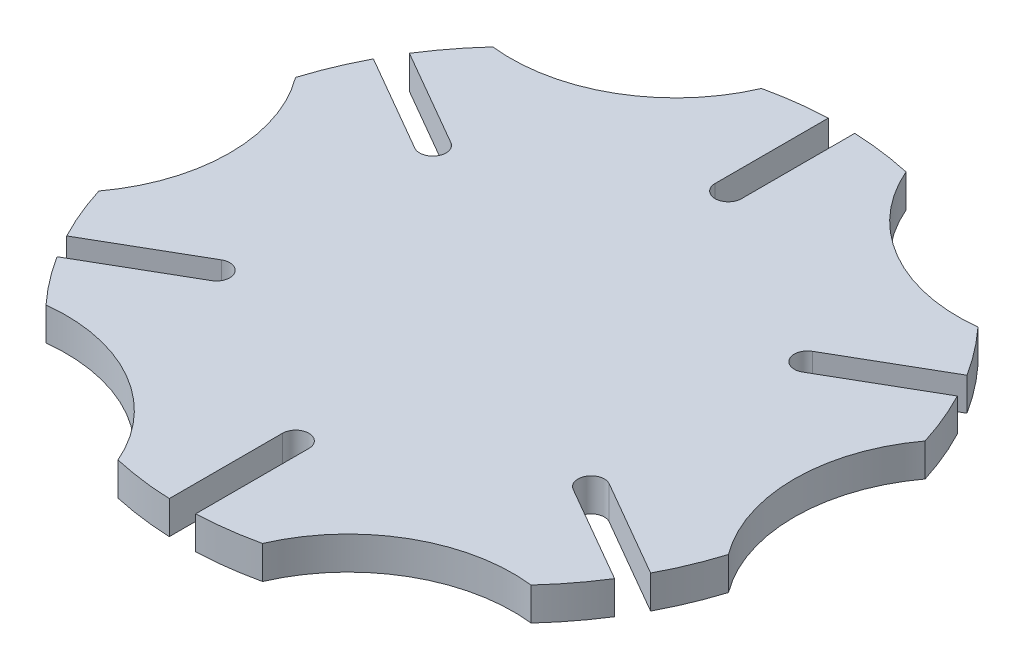
ISO-10303-21;
HEADER;
FILE_DESCRIPTION(('STEP AP214'),'2;1');
FILE_NAME('part.step','',(''),(''),'','','');
FILE_SCHEMA(('AUTOMOTIVE_DESIGN { 1 0 10303 214 1 1 1 1 }'));
ENDSEC;
DATA;
#1=APPLICATION_CONTEXT('core data for automotive mechanical design processes');
#2=APPLICATION_PROTOCOL_DEFINITION('international standard','automotive_design',2000,#1);
#3=PRODUCT_CONTEXT('',#1,'mechanical');
#4=PRODUCT('Part','Part','',(#3));
#5=PRODUCT_RELATED_PRODUCT_CATEGORY('part','',(#4));
#6=PRODUCT_DEFINITION_FORMATION('','',#4);
#7=PRODUCT_DEFINITION_CONTEXT('part definition',#1,'design');
#8=PRODUCT_DEFINITION('design','',#6,#7);
#9=PRODUCT_DEFINITION_SHAPE('','',#8);
#10=(LENGTH_UNIT() NAMED_UNIT(*) SI_UNIT(.MILLI.,.METRE.));
#11=(NAMED_UNIT(*) PLANE_ANGLE_UNIT() SI_UNIT($,.RADIAN.));
#12=(NAMED_UNIT(*) SI_UNIT($,.STERADIAN.) SOLID_ANGLE_UNIT());
#13=UNCERTAINTY_MEASURE_WITH_UNIT(LENGTH_MEASURE(1.E-05),#10,'distance_accuracy_value','');
#14=(GEOMETRIC_REPRESENTATION_CONTEXT(3) GLOBAL_UNCERTAINTY_ASSIGNED_CONTEXT((#13)) GLOBAL_UNIT_ASSIGNED_CONTEXT((#10,
#11,#12)) REPRESENTATION_CONTEXT('',''));
#15=CARTESIAN_POINT('',(0.,0.,0.));
#16=DIRECTION('',(0.,0.,1.));
#17=DIRECTION('',(1.,0.,0.));
#18=AXIS2_PLACEMENT_3D('',#15,#16,#17);
#19=CARTESIAN_POINT('',(67.7961676170541,5.,0.));
#20=DIRECTION('',(0.,-1.,0.));
#21=DIRECTION('',(0.,0.,-1.));
#22=AXIS2_PLACEMENT_3D('',#19,#20,#21);
#23=CYLINDRICAL_SURFACE('',#22,25.);
#24=CARTESIAN_POINT('',(67.7961676170541,0.,0.));
#25=DIRECTION('',(0.,1.,0.));
#26=DIRECTION('',(0.,0.,1.));
#27=AXIS2_PLACEMENT_3D('',#24,#25,#26);
#28=CIRCLE('',#27,25.);
#29=CARTESIAN_POINT('',(47.726299074255,0.,-14.9063871100534));
#30=VERTEX_POINT('',#29);
#31=CARTESIAN_POINT('',(47.726299074255,0.,14.9063871100534));
#32=VERTEX_POINT('',#31);
#33=EDGE_CURVE('E314',#30,#32,#28,.T.);
#34=ORIENTED_EDGE('',*,*,#33,.F.);
#35=DIRECTION('',(0.,-1.,0.));
#36=VECTOR('',#35,1.);
#37=CARTESIAN_POINT('',(47.726299074255,5.,-14.9063871100534));
#38=LINE('',#37,#36);
#39=CARTESIAN_POINT('',(47.726299074255,5.,-14.9063871100534));
#40=VERTEX_POINT('',#39);
#41=EDGE_CURVE('E11',#40,#30,#38,.T.);
#42=ORIENTED_EDGE('',*,*,#41,.F.);
#43=CARTESIAN_POINT('',(67.7961676170541,5.,0.));
#44=DIRECTION('',(0.,1.,0.));
#45=DIRECTION('',(0.,0.,1.));
#46=AXIS2_PLACEMENT_3D('',#43,#44,#45);
#47=CIRCLE('',#46,25.);
#48=CARTESIAN_POINT('',(47.726299074255,5.,14.9063871100534));
#49=VERTEX_POINT('',#48);
#50=EDGE_CURVE('E759',#40,#49,#47,.T.);
#51=ORIENTED_EDGE('',*,*,#50,.T.);
#52=DIRECTION('',(0.,-1.,0.));
#53=VECTOR('',#52,1.);
#54=CARTESIAN_POINT('',(47.726299074255,5.,14.9063871100534));
#55=LINE('',#54,#53);
#56=EDGE_CURVE('E182',#49,#32,#55,.T.);
#57=ORIENTED_EDGE('',*,*,#56,.T.);
#58=EDGE_LOOP('',(#34,#42,#51,#57));
#59=FACE_BOUND('',#58,.T.);
#60=ADVANCED_FACE('F47',(#59),#23,.F.);
#61=CARTESIAN_POINT('',(0.,5.,0.));
#62=DIRECTION('',(0.,-1.,0.));
#63=DIRECTION('',(0.,0.,-1.));
#64=AXIS2_PLACEMENT_3D('',#61,#62,#63);
#65=CYLINDRICAL_SURFACE('',#64,50.);
#66=CARTESIAN_POINT('',(0.,0.,0.));
#67=DIRECTION('',(0.,1.,0.));
#68=DIRECTION('',(0.,0.,1.));
#69=AXIS2_PLACEMENT_3D('',#66,#67,#68);
#70=CIRCLE('',#69,50.);
#71=CARTESIAN_POINT('',(44.266615305568,0.,-23.2479411860245));
#72=VERTEX_POINT('',#71);
#73=EDGE_CURVE('E318',#30,#72,#70,.T.);
#74=ORIENTED_EDGE('',*,*,#73,.T.);
#75=DIRECTION('',(0.,-1.,0.));
#76=VECTOR('',#75,1.);
#77=CARTESIAN_POINT('',(44.266615305568,5.,-23.2479411860245));
#78=LINE('',#77,#76);
#79=CARTESIAN_POINT('',(44.266615305568,5.,-23.2479411860245));
#80=VERTEX_POINT('',#79);
#81=EDGE_CURVE('E56',#80,#72,#78,.T.);
#82=ORIENTED_EDGE('',*,*,#81,.F.);
#83=CARTESIAN_POINT('',(0.,5.,0.));
#84=DIRECTION('',(0.,1.,0.));
#85=DIRECTION('',(0.,0.,1.));
#86=AXIS2_PLACEMENT_3D('',#83,#84,#85);
#87=CIRCLE('',#86,50.);
#88=EDGE_CURVE('E311',#40,#80,#87,.T.);
#89=ORIENTED_EDGE('',*,*,#88,.F.);
#90=ORIENTED_EDGE('',*,*,#41,.T.);
#91=EDGE_LOOP('',(#74,#82,#89,#90));
#92=FACE_BOUND('',#91,.T.);
#93=ADVANCED_FACE('F763',(#92),#65,.T.);
#94=CARTESIAN_POINT('',(0.999999999999993,5.,1.73205080756889));
#95=DIRECTION('',(0.499999999999995,0.,0.866025403784441));
#96=DIRECTION('',(0.866025403784441,0.,-0.499999999999995));
#97=AXIS2_PLACEMENT_3D('',#94,#95,#96);
#98=PLANE('',#97);
#99=DIRECTION('',(-0.866025403784441,0.,0.499999999999995));
#100=VECTOR('',#99,1.);
#101=CARTESIAN_POINT('',(0.999999999999993,0.,1.73205080756889));
#102=LINE('',#101,#100);
#103=CARTESIAN_POINT('',(29.4023143031415,0.,-14.666033000958));
#104=VERTEX_POINT('',#103);
#105=EDGE_CURVE('E321',#72,#104,#102,.T.);
#106=ORIENTED_EDGE('',*,*,#105,.T.);
#107=DIRECTION('',(0.,-1.,0.));
#108=VECTOR('',#107,1.);
#109=CARTESIAN_POINT('',(29.4023143031415,5.,-14.666033000958));
#110=LINE('',#109,#108);
#111=CARTESIAN_POINT('',(29.4023143031415,5.,-14.666033000958));
#112=VERTEX_POINT('',#111);
#113=EDGE_CURVE('E522',#112,#104,#110,.T.);
#114=ORIENTED_EDGE('',*,*,#113,.F.);
#115=DIRECTION('',(-0.866025403784441,0.,0.499999999999995));
#116=VECTOR('',#115,1.);
#117=CARTESIAN_POINT('',(0.999999999999993,5.,1.73205080756889));
#118=LINE('',#117,#116);
#119=EDGE_CURVE('E532',#80,#112,#118,.T.);
#120=ORIENTED_EDGE('',*,*,#119,.F.);
#121=ORIENTED_EDGE('',*,*,#81,.T.);
#122=EDGE_LOOP('',(#106,#114,#120,#121));
#123=FACE_BOUND('',#122,.T.);
#124=ADVANCED_FACE('F530',(#123),#98,.F.);
#125=CARTESIAN_POINT('',(28.4023143031415,5.,-16.3980838085269));
#126=DIRECTION('',(0.,-1.,0.));
#127=DIRECTION('',(0.,0.,-1.));
#128=AXIS2_PLACEMENT_3D('',#125,#126,#127);
#129=CYLINDRICAL_SURFACE('',#128,2.);
#130=CARTESIAN_POINT('',(28.4023143031415,0.,-16.3980838085269));
#131=DIRECTION('',(0.,1.,0.));
#132=DIRECTION('',(0.,0.,1.));
#133=AXIS2_PLACEMENT_3D('',#130,#131,#132);
#134=CIRCLE('',#133,2.);
#135=CARTESIAN_POINT('',(27.4023143031415,0.,-18.1301346160958));
#136=VERTEX_POINT('',#135);
#137=EDGE_CURVE('E326',#136,#104,#134,.T.);
#138=ORIENTED_EDGE('',*,*,#137,.F.);
#139=DIRECTION('',(0.,-1.,0.));
#140=VECTOR('',#139,1.);
#141=CARTESIAN_POINT('',(27.4023143031415,5.,-18.1301346160958));
#142=LINE('',#141,#140);
#143=CARTESIAN_POINT('',(27.4023143031415,5.,-18.1301346160958));
#144=VERTEX_POINT('',#143);
#145=EDGE_CURVE('E519',#144,#136,#142,.T.);
#146=ORIENTED_EDGE('',*,*,#145,.F.);
#147=CARTESIAN_POINT('',(28.4023143031415,5.,-16.3980838085269));
#148=DIRECTION('',(0.,1.,0.));
#149=DIRECTION('',(0.,0.,1.));
#150=AXIS2_PLACEMENT_3D('',#147,#148,#149);
#151=CIRCLE('',#150,2.);
#152=EDGE_CURVE('E544',#144,#112,#151,.T.);
#153=ORIENTED_EDGE('',*,*,#152,.T.);
#154=ORIENTED_EDGE('',*,*,#113,.T.);
#155=EDGE_LOOP('',(#138,#146,#153,#154));
#156=FACE_BOUND('',#155,.T.);
#157=ADVANCED_FACE('F541',(#156),#129,.F.);
#158=CARTESIAN_POINT('',(-0.999999999999983,5.,-1.73205080756887));
#159=DIRECTION('',(0.499999999999995,0.,0.866025403784441));
#160=DIRECTION('',(0.866025403784441,0.,-0.499999999999995));
#161=AXIS2_PLACEMENT_3D('',#158,#159,#160);
#162=PLANE('',#161);
#163=DIRECTION('',(-0.866025403784441,0.,0.499999999999995));
#164=VECTOR('',#163,1.);
#165=CARTESIAN_POINT('',(-0.999999999999983,0.,-1.73205080756887));
#166=LINE('',#165,#164);
#167=CARTESIAN_POINT('',(42.266615305568,0.,-26.7120428011622));
#168=VERTEX_POINT('',#167);
#169=EDGE_CURVE('E330',#168,#136,#166,.T.);
#170=ORIENTED_EDGE('',*,*,#169,.F.);
#171=DIRECTION('',(0.,-1.,0.));
#172=VECTOR('',#171,1.);
#173=CARTESIAN_POINT('',(42.266615305568,5.,-26.7120428011622));
#174=LINE('',#173,#172);
#175=CARTESIAN_POINT('',(42.266615305568,5.,-26.7120428011622));
#176=VERTEX_POINT('',#175);
#177=EDGE_CURVE('E516',#176,#168,#174,.T.);
#178=ORIENTED_EDGE('',*,*,#177,.F.);
#179=DIRECTION('',(-0.866025403784441,0.,0.499999999999995));
#180=VECTOR('',#179,1.);
#181=CARTESIAN_POINT('',(-0.999999999999983,5.,-1.73205080756887));
#182=LINE('',#181,#180);
#183=EDGE_CURVE('E548',#176,#144,#182,.T.);
#184=ORIENTED_EDGE('',*,*,#183,.T.);
#185=ORIENTED_EDGE('',*,*,#145,.T.);
#186=EDGE_LOOP('',(#170,#178,#184,#185));
#187=FACE_BOUND('',#186,.T.);
#188=ADVANCED_FACE('F828',(#187),#162,.T.);
#189=CARTESIAN_POINT('',(0.,5.,0.));
#190=DIRECTION('',(0.,-1.,0.));
#191=DIRECTION('',(0.,0.,-1.));
#192=AXIS2_PLACEMENT_3D('',#189,#190,#191);
#193=CYLINDRICAL_SURFACE('',#192,50.);
#194=CARTESIAN_POINT('',(0.,0.,0.));
#195=DIRECTION('',(0.,1.,0.));
#196=DIRECTION('',(0.,0.,1.));
#197=AXIS2_PLACEMENT_3D('',#194,#195,#196);
#198=CIRCLE('',#197,50.);
#199=CARTESIAN_POINT('',(36.7724594530786,0.,-33.8789938718919));
#200=VERTEX_POINT('',#199);
#201=EDGE_CURVE('E334',#168,#200,#198,.T.);
#202=ORIENTED_EDGE('',*,*,#201,.T.);
#203=DIRECTION('',(0.,-1.,0.));
#204=VECTOR('',#203,1.);
#205=CARTESIAN_POINT('',(36.7724594530786,5.,-33.8789938718919));
#206=LINE('',#205,#204);
#207=CARTESIAN_POINT('',(36.7724594530786,5.,-33.8789938718919));
#208=VERTEX_POINT('',#207);
#209=EDGE_CURVE('E513',#208,#200,#206,.T.);
#210=ORIENTED_EDGE('',*,*,#209,.F.);
#211=CARTESIAN_POINT('',(0.,5.,0.));
#212=DIRECTION('',(0.,1.,0.));
#213=DIRECTION('',(0.,0.,1.));
#214=AXIS2_PLACEMENT_3D('',#211,#212,#213);
#215=CIRCLE('',#214,50.);
#216=EDGE_CURVE('E552',#176,#208,#215,.T.);
#217=ORIENTED_EDGE('',*,*,#216,.F.);
#218=ORIENTED_EDGE('',*,*,#177,.T.);
#219=EDGE_LOOP('',(#202,#210,#217,#218));
#220=FACE_BOUND('',#219,.T.);
#221=ADVANCED_FACE('F788',(#220),#193,.T.);
#222=CARTESIAN_POINT('',(33.898083808527,5.,-58.7132034355968));
#223=DIRECTION('',(0.,-1.,0.));
#224=DIRECTION('',(0.,0.,-1.));
#225=AXIS2_PLACEMENT_3D('',#222,#223,#224);
#226=CYLINDRICAL_SURFACE('',#225,25.);
#227=CARTESIAN_POINT('',(33.898083808527,0.,-58.7132034355968));
#228=DIRECTION('',(0.,1.,0.));
#229=DIRECTION('',(0.,0.,1.));
#230=AXIS2_PLACEMENT_3D('',#227,#228,#229);
#231=CIRCLE('',#230,25.);
#232=CARTESIAN_POINT('',(10.9538396211764,0.,-48.7853809819453));
#233=VERTEX_POINT('',#232);
#234=EDGE_CURVE('E338',#233,#200,#231,.T.);
#235=ORIENTED_EDGE('',*,*,#234,.F.);
#236=DIRECTION('',(0.,-1.,0.));
#237=VECTOR('',#236,1.);
#238=CARTESIAN_POINT('',(10.9538396211764,5.,-48.7853809819453));
#239=LINE('',#238,#237);
#240=CARTESIAN_POINT('',(10.9538396211764,5.,-48.7853809819453));
#241=VERTEX_POINT('',#240);
#242=EDGE_CURVE('E510',#241,#233,#239,.T.);
#243=ORIENTED_EDGE('',*,*,#242,.F.);
#244=CARTESIAN_POINT('',(33.898083808527,5.,-58.7132034355968));
#245=DIRECTION('',(0.,1.,0.));
#246=DIRECTION('',(0.,0.,1.));
#247=AXIS2_PLACEMENT_3D('',#244,#245,#246);
#248=CIRCLE('',#247,25.);
#249=EDGE_CURVE('E558',#241,#208,#248,.T.);
#250=ORIENTED_EDGE('',*,*,#249,.T.);
#251=ORIENTED_EDGE('',*,*,#209,.T.);
#252=EDGE_LOOP('',(#235,#243,#250,#251));
#253=FACE_BOUND('',#252,.T.);
#254=ADVANCED_FACE('F824',(#253),#226,.F.);
#255=CARTESIAN_POINT('',(2.00000000000029,0.,-49.9599839871872));
#256=VERTEX_POINT('',#255);
#257=EDGE_CURVE('E340',#233,#256,#198,.T.);
#258=ORIENTED_EDGE('',*,*,#257,.T.);
#259=DIRECTION('',(0.,-1.,0.));
#260=VECTOR('',#259,1.);
#261=CARTESIAN_POINT('',(2.00000000000029,5.,-49.9599839871872));
#262=LINE('',#261,#260);
#263=CARTESIAN_POINT('',(2.00000000000029,5.,-49.9599839871872));
#264=VERTEX_POINT('',#263);
#265=EDGE_CURVE('E506',#264,#256,#262,.T.);
#266=ORIENTED_EDGE('',*,*,#265,.F.);
#267=EDGE_CURVE('E560',#241,#264,#215,.T.);
#268=ORIENTED_EDGE('',*,*,#267,.F.);
#269=ORIENTED_EDGE('',*,*,#242,.T.);
#270=EDGE_LOOP('',(#258,#266,#268,#269));
#271=FACE_BOUND('',#270,.T.);
#272=ADVANCED_FACE('F671',(#271),#193,.T.);
#273=CARTESIAN_POINT('',(2.00000000000003,5.,0.));
#274=DIRECTION('',(1.,0.,0.));
#275=DIRECTION('',(0.,0.,-1.));
#276=AXIS2_PLACEMENT_3D('',#273,#274,#275);
#277=PLANE('',#276);
#278=DIRECTION('',(0.,0.,1.));
#279=VECTOR('',#278,1.);
#280=CARTESIAN_POINT('',(2.00000000000003,0.,0.));
#281=LINE('',#280,#279);
#282=CARTESIAN_POINT('',(2.0000000000002,0.,-32.7961676170541));
#283=VERTEX_POINT('',#282);
#284=EDGE_CURVE('E344',#256,#283,#281,.T.);
#285=ORIENTED_EDGE('',*,*,#284,.T.);
#286=DIRECTION('',(0.,-1.,0.));
#287=VECTOR('',#286,1.);
#288=CARTESIAN_POINT('',(2.0000000000002,5.,-32.7961676170541));
#289=LINE('',#288,#287);
#290=CARTESIAN_POINT('',(2.0000000000002,5.,-32.7961676170541));
#291=VERTEX_POINT('',#290);
#292=EDGE_CURVE('E503',#291,#283,#289,.T.);
#293=ORIENTED_EDGE('',*,*,#292,.F.);
#294=DIRECTION('',(0.,0.,1.));
#295=VECTOR('',#294,1.);
#296=CARTESIAN_POINT('',(2.00000000000003,5.,0.));
#297=LINE('',#296,#295);
#298=EDGE_CURVE('E564',#264,#291,#297,.T.);
#299=ORIENTED_EDGE('',*,*,#298,.F.);
#300=ORIENTED_EDGE('',*,*,#265,.T.);
#301=EDGE_LOOP('',(#285,#293,#299,#300));
#302=FACE_BOUND('',#301,.T.);
#303=ADVANCED_FACE('F675',(#302),#277,.F.);
#304=CARTESIAN_POINT('',(1.90819582357449E-13,5.,-32.7961676170541));
#305=DIRECTION('',(0.,-1.,0.));
#306=DIRECTION('',(0.,0.,-1.));
#307=AXIS2_PLACEMENT_3D('',#304,#305,#306);
#308=CYLINDRICAL_SURFACE('',#307,2.);
#309=CARTESIAN_POINT('',(1.90819582357449E-13,0.,-32.7961676170541));
#310=DIRECTION('',(0.,1.,0.));
#311=DIRECTION('',(0.,0.,1.));
#312=AXIS2_PLACEMENT_3D('',#309,#310,#311);
#313=CIRCLE('',#312,2.);
#314=CARTESIAN_POINT('',(-1.99999999999981,0.,-32.7961676170541));
#315=VERTEX_POINT('',#314);
#316=EDGE_CURVE('E348',#315,#283,#313,.T.);
#317=ORIENTED_EDGE('',*,*,#316,.F.);
#318=DIRECTION('',(0.,-1.,0.));
#319=VECTOR('',#318,1.);
#320=CARTESIAN_POINT('',(-1.99999999999981,5.,-32.7961676170541));
#321=LINE('',#320,#319);
#322=CARTESIAN_POINT('',(-1.99999999999981,5.,-32.7961676170541));
#323=VERTEX_POINT('',#322);
#324=EDGE_CURVE('E500',#323,#315,#321,.T.);
#325=ORIENTED_EDGE('',*,*,#324,.F.);
#326=CARTESIAN_POINT('',(1.90819582357449E-13,5.,-32.7961676170541));
#327=DIRECTION('',(0.,1.,0.));
#328=DIRECTION('',(0.,0.,1.));
#329=AXIS2_PLACEMENT_3D('',#326,#327,#328);
#330=CIRCLE('',#329,2.);
#331=EDGE_CURVE('E567',#323,#291,#330,.T.);
#332=ORIENTED_EDGE('',*,*,#331,.T.);
#333=ORIENTED_EDGE('',*,*,#292,.T.);
#334=EDGE_LOOP('',(#317,#325,#332,#333));
#335=FACE_BOUND('',#334,.T.);
#336=ADVANCED_FACE('F678',(#335),#308,.F.);
#337=CARTESIAN_POINT('',(-1.99999999999998,5.,0.));
#338=DIRECTION('',(1.,0.,0.));
#339=DIRECTION('',(0.,0.,-1.));
#340=AXIS2_PLACEMENT_3D('',#337,#338,#339);
#341=PLANE('',#340);
#342=DIRECTION('',(0.,0.,1.));
#343=VECTOR('',#342,1.);
#344=CARTESIAN_POINT('',(-1.99999999999998,0.,0.));
#345=LINE('',#344,#343);
#346=CARTESIAN_POINT('',(-1.99999999999972,0.,-49.9599839871872));
#347=VERTEX_POINT('',#346);
#348=EDGE_CURVE('E352',#347,#315,#345,.T.);
#349=ORIENTED_EDGE('',*,*,#348,.F.);
#350=DIRECTION('',(0.,-1.,0.));
#351=VECTOR('',#350,1.);
#352=CARTESIAN_POINT('',(-1.99999999999972,5.,-49.9599839871872));
#353=LINE('',#352,#351);
#354=CARTESIAN_POINT('',(-1.99999999999972,5.,-49.9599839871872));
#355=VERTEX_POINT('',#354);
#356=EDGE_CURVE('E497',#355,#347,#353,.T.);
#357=ORIENTED_EDGE('',*,*,#356,.F.);
#358=DIRECTION('',(0.,0.,1.));
#359=VECTOR('',#358,1.);
#360=CARTESIAN_POINT('',(-1.99999999999998,5.,0.));
#361=LINE('',#360,#359);
#362=EDGE_CURVE('E571',#355,#323,#361,.T.);
#363=ORIENTED_EDGE('',*,*,#362,.T.);
#364=ORIENTED_EDGE('',*,*,#324,.T.);
#365=EDGE_LOOP('',(#349,#357,#363,#364));
#366=FACE_BOUND('',#365,.T.);
#367=ADVANCED_FACE('F681',(#366),#341,.T.);
#368=CARTESIAN_POINT('',(-10.9538396211764,0.,-48.7853809819453));
#369=VERTEX_POINT('',#368);
#370=EDGE_CURVE('E356',#347,#369,#198,.T.);
#371=ORIENTED_EDGE('',*,*,#370,.T.);
#372=DIRECTION('',(0.,-1.,0.));
#373=VECTOR('',#372,1.);
#374=CARTESIAN_POINT('',(-10.9538396211764,5.,-48.7853809819453));
#375=LINE('',#374,#373);
#376=CARTESIAN_POINT('',(-10.9538396211764,5.,-48.7853809819453));
#377=VERTEX_POINT('',#376);
#378=EDGE_CURVE('E494',#377,#369,#375,.T.);
#379=ORIENTED_EDGE('',*,*,#378,.F.);
#380=EDGE_CURVE('E575',#355,#377,#215,.T.);
#381=ORIENTED_EDGE('',*,*,#380,.F.);
#382=ORIENTED_EDGE('',*,*,#356,.T.);
#383=EDGE_LOOP('',(#371,#379,#381,#382));
#384=FACE_BOUND('',#383,.T.);
#385=ADVANCED_FACE('F685',(#384),#193,.T.);
#386=CARTESIAN_POINT('',(-33.8980838085271,5.,-58.7132034355968));
#387=DIRECTION('',(0.,-1.,0.));
#388=DIRECTION('',(0.,0.,-1.));
#389=AXIS2_PLACEMENT_3D('',#386,#387,#388);
#390=CYLINDRICAL_SURFACE('',#389,25.);
#391=CARTESIAN_POINT('',(-33.8980838085271,0.,-58.7132034355968));
#392=DIRECTION('',(0.,1.,0.));
#393=DIRECTION('',(0.,0.,1.));
#394=AXIS2_PLACEMENT_3D('',#391,#392,#393);
#395=CIRCLE('',#394,25.);
#396=CARTESIAN_POINT('',(-36.7724594530786,0.,-33.8789938718919));
#397=VERTEX_POINT('',#396);
#398=EDGE_CURVE('E357',#397,#369,#395,.T.);
#399=ORIENTED_EDGE('',*,*,#398,.F.);
#400=DIRECTION('',(0.,-1.,0.));
#401=VECTOR('',#400,1.);
#402=CARTESIAN_POINT('',(-36.7724594530786,5.,-33.8789938718919));
#403=LINE('',#402,#401);
#404=CARTESIAN_POINT('',(-36.7724594530786,5.,-33.8789938718919));
#405=VERTEX_POINT('',#404);
#406=EDGE_CURVE('E491',#405,#397,#403,.T.);
#407=ORIENTED_EDGE('',*,*,#406,.F.);
#408=CARTESIAN_POINT('',(-33.8980838085271,5.,-58.7132034355968));
#409=DIRECTION('',(0.,1.,0.));
#410=DIRECTION('',(0.,0.,1.));
#411=AXIS2_PLACEMENT_3D('',#408,#409,#410);
#412=CIRCLE('',#411,25.);
#413=EDGE_CURVE('E576',#405,#377,#412,.T.);
#414=ORIENTED_EDGE('',*,*,#413,.T.);
#415=ORIENTED_EDGE('',*,*,#378,.T.);
#416=EDGE_LOOP('',(#399,#407,#414,#415));
#417=FACE_BOUND('',#416,.T.);
#418=ADVANCED_FACE('F688',(#417),#390,.F.);
#419=CARTESIAN_POINT('',(-42.2666153055678,0.,-26.7120428011627));
#420=VERTEX_POINT('',#419);
#421=EDGE_CURVE('E361',#397,#420,#198,.T.);
#422=ORIENTED_EDGE('',*,*,#421,.T.);
#423=DIRECTION('',(0.,-1.,0.));
#424=VECTOR('',#423,1.);
#425=CARTESIAN_POINT('',(-42.2666153055678,5.,-26.7120428011627));
#426=LINE('',#425,#424);
#427=CARTESIAN_POINT('',(-42.2666153055678,5.,-26.7120428011627));
#428=VERTEX_POINT('',#427);
#429=EDGE_CURVE('E487',#428,#420,#426,.T.);
#430=ORIENTED_EDGE('',*,*,#429,.F.);
#431=EDGE_CURVE('E580',#405,#428,#215,.T.);
#432=ORIENTED_EDGE('',*,*,#431,.F.);
#433=ORIENTED_EDGE('',*,*,#406,.T.);
#434=EDGE_LOOP('',(#422,#430,#432,#433));
#435=FACE_BOUND('',#434,.T.);
#436=ADVANCED_FACE('F691',(#435),#193,.T.);
#437=CARTESIAN_POINT('',(1.,5.,-1.73205080756886));
#438=DIRECTION('',(0.500000000000004,0.,-0.866025403784436));
#439=DIRECTION('',(-0.866025403784436,0.,-0.500000000000004));
#440=AXIS2_PLACEMENT_3D('',#437,#438,#439);
#441=PLANE('',#440);
#442=DIRECTION('',(0.866025403784436,0.,0.500000000000005));
#443=VECTOR('',#442,1.);
#444=CARTESIAN_POINT('',(1.,0.,-1.73205080756886));
#445=LINE('',#444,#443);
#446=CARTESIAN_POINT('',(-27.4023143031413,0.,-18.1301346160961));
#447=VERTEX_POINT('',#446);
#448=EDGE_CURVE('E362',#420,#447,#445,.T.);
#449=ORIENTED_EDGE('',*,*,#448,.T.);
#450=DIRECTION('',(0.,-1.,0.));
#451=VECTOR('',#450,1.);
#452=CARTESIAN_POINT('',(-27.4023143031413,5.,-18.1301346160961));
#453=LINE('',#452,#451);
#454=CARTESIAN_POINT('',(-27.4023143031413,5.,-18.1301346160961));
#455=VERTEX_POINT('',#454);
#456=EDGE_CURVE('E484',#455,#447,#453,.T.);
#457=ORIENTED_EDGE('',*,*,#456,.F.);
#458=DIRECTION('',(0.866025403784436,0.,0.500000000000005));
#459=VECTOR('',#458,1.);
#460=CARTESIAN_POINT('',(1.,5.,-1.73205080756886));
#461=LINE('',#460,#459);
#462=EDGE_CURVE('E581',#428,#455,#461,.T.);
#463=ORIENTED_EDGE('',*,*,#462,.F.);
#464=ORIENTED_EDGE('',*,*,#429,.T.);
#465=EDGE_LOOP('',(#449,#457,#463,#464));
#466=FACE_BOUND('',#465,.T.);
#467=ADVANCED_FACE('F696',(#466),#441,.F.);
#468=CARTESIAN_POINT('',(-28.4023143031413,5.,-16.3980838085272));
#469=DIRECTION('',(0.,-1.,0.));
#470=DIRECTION('',(0.,0.,-1.));
#471=AXIS2_PLACEMENT_3D('',#468,#469,#470);
#472=CYLINDRICAL_SURFACE('',#471,1.99999999999998);
#473=CARTESIAN_POINT('',(-28.4023143031413,0.,-16.3980838085272));
#474=DIRECTION('',(0.,1.,0.));
#475=DIRECTION('',(0.,0.,1.));
#476=AXIS2_PLACEMENT_3D('',#473,#474,#475);
#477=CIRCLE('',#476,1.99999999999998);
#478=CARTESIAN_POINT('',(-29.4023143031413,0.,-14.6660330009584));
#479=VERTEX_POINT('',#478);
#480=EDGE_CURVE('E366',#479,#447,#477,.T.);
#481=ORIENTED_EDGE('',*,*,#480,.F.);
#482=DIRECTION('',(0.,-1.,0.));
#483=VECTOR('',#482,1.);
#484=CARTESIAN_POINT('',(-29.4023143031413,5.,-14.6660330009584));
#485=LINE('',#484,#483);
#486=CARTESIAN_POINT('',(-29.4023143031413,5.,-14.6660330009584));
#487=VERTEX_POINT('',#486);
#488=EDGE_CURVE('E481',#487,#479,#485,.T.);
#489=ORIENTED_EDGE('',*,*,#488,.F.);
#490=CARTESIAN_POINT('',(-28.4023143031413,5.,-16.3980838085272));
#491=DIRECTION('',(0.,1.,0.));
#492=DIRECTION('',(0.,0.,1.));
#493=AXIS2_PLACEMENT_3D('',#490,#491,#492);
#494=CIRCLE('',#493,1.99999999999998);
#495=EDGE_CURVE('E584',#487,#455,#494,.T.);
#496=ORIENTED_EDGE('',*,*,#495,.T.);
#497=ORIENTED_EDGE('',*,*,#456,.T.);
#498=EDGE_LOOP('',(#481,#489,#496,#497));
#499=FACE_BOUND('',#498,.T.);
#500=ADVANCED_FACE('F811',(#499),#472,.F.);
#501=CARTESIAN_POINT('',(-0.999999999999985,5.,1.73205080756883));
#502=DIRECTION('',(0.500000000000004,0.,-0.866025403784436));
#503=DIRECTION('',(-0.866025403784436,0.,-0.500000000000004));
#504=AXIS2_PLACEMENT_3D('',#501,#502,#503);
#505=PLANE('',#504);
#506=DIRECTION('',(0.866025403784436,0.,0.500000000000004));
#507=VECTOR('',#506,1.);
#508=CARTESIAN_POINT('',(-0.999999999999985,0.,1.73205080756883));
#509=LINE('',#508,#507);
#510=CARTESIAN_POINT('',(-44.2666153055678,0.,-23.247941186025));
#511=VERTEX_POINT('',#510);
#512=EDGE_CURVE('E370',#511,#479,#509,.T.);
#513=ORIENTED_EDGE('',*,*,#512,.F.);
#514=DIRECTION('',(0.,-1.,0.));
#515=VECTOR('',#514,1.);
#516=CARTESIAN_POINT('',(-44.2666153055678,5.,-23.247941186025));
#517=LINE('',#516,#515);
#518=CARTESIAN_POINT('',(-44.2666153055678,5.,-23.247941186025));
#519=VERTEX_POINT('',#518);
#520=EDGE_CURVE('E478',#519,#511,#517,.T.);
#521=ORIENTED_EDGE('',*,*,#520,.F.);
#522=DIRECTION('',(0.866025403784436,0.,0.500000000000004));
#523=VECTOR('',#522,1.);
#524=CARTESIAN_POINT('',(-0.999999999999985,5.,1.73205080756883));
#525=LINE('',#524,#523);
#526=EDGE_CURVE('E588',#519,#487,#525,.T.);
#527=ORIENTED_EDGE('',*,*,#526,.T.);
#528=ORIENTED_EDGE('',*,*,#488,.T.);
#529=EDGE_LOOP('',(#513,#521,#527,#528));
#530=FACE_BOUND('',#529,.T.);
#531=ADVANCED_FACE('F701',(#530),#505,.T.);
#532=CARTESIAN_POINT('',(-47.726299074255,0.,-14.9063871100534));
#533=VERTEX_POINT('',#532);
#534=EDGE_CURVE('E374',#511,#533,#198,.T.);
#535=ORIENTED_EDGE('',*,*,#534,.T.);
#536=DIRECTION('',(0.,-1.,0.));
#537=VECTOR('',#536,1.);
#538=CARTESIAN_POINT('',(-47.726299074255,5.,-14.9063871100534));
#539=LINE('',#538,#537);
#540=CARTESIAN_POINT('',(-47.726299074255,5.,-14.9063871100534));
#541=VERTEX_POINT('',#540);
#542=EDGE_CURVE('E475',#541,#533,#539,.T.);
#543=ORIENTED_EDGE('',*,*,#542,.F.);
#544=EDGE_CURVE('E592',#519,#541,#215,.T.);
#545=ORIENTED_EDGE('',*,*,#544,.F.);
#546=ORIENTED_EDGE('',*,*,#520,.T.);
#547=EDGE_LOOP('',(#535,#543,#545,#546));
#548=FACE_BOUND('',#547,.T.);
#549=ADVANCED_FACE('F706',(#548),#193,.T.);
#550=CARTESIAN_POINT('',(-67.7961676170541,5.,0.));
#551=DIRECTION('',(0.,-1.,0.));
#552=DIRECTION('',(0.,0.,-1.));
#553=AXIS2_PLACEMENT_3D('',#550,#551,#552);
#554=CYLINDRICAL_SURFACE('',#553,25.);
#555=CARTESIAN_POINT('',(-67.7961676170541,0.,0.));
#556=DIRECTION('',(0.,1.,0.));
#557=DIRECTION('',(0.,0.,1.));
#558=AXIS2_PLACEMENT_3D('',#555,#556,#557);
#559=CIRCLE('',#558,25.);
#560=CARTESIAN_POINT('',(-47.726299074255,0.,14.9063871100534));
#561=VERTEX_POINT('',#560);
#562=EDGE_CURVE('E375',#561,#533,#559,.T.);
#563=ORIENTED_EDGE('',*,*,#562,.F.);
#564=DIRECTION('',(0.,-1.,0.));
#565=VECTOR('',#564,1.);
#566=CARTESIAN_POINT('',(-47.726299074255,5.,14.9063871100534));
#567=LINE('',#566,#565);
#568=CARTESIAN_POINT('',(-47.726299074255,5.,14.9063871100534));
#569=VERTEX_POINT('',#568);
#570=EDGE_CURVE('E472',#569,#561,#567,.T.);
#571=ORIENTED_EDGE('',*,*,#570,.F.);
#572=CARTESIAN_POINT('',(-67.7961676170541,5.,0.));
#573=DIRECTION('',(0.,1.,0.));
#574=DIRECTION('',(0.,0.,1.));
#575=AXIS2_PLACEMENT_3D('',#572,#573,#574);
#576=CIRCLE('',#575,25.);
#577=EDGE_CURVE('E593',#569,#541,#576,.T.);
#578=ORIENTED_EDGE('',*,*,#577,.T.);
#579=ORIENTED_EDGE('',*,*,#542,.T.);
#580=EDGE_LOOP('',(#563,#571,#578,#579));
#581=FACE_BOUND('',#580,.T.);
#582=ADVANCED_FACE('F709',(#581),#554,.F.);
#583=CARTESIAN_POINT('',(-44.266615305568,0.,23.2479411860245));
#584=VERTEX_POINT('',#583);
#585=EDGE_CURVE('E379',#561,#584,#198,.T.);
#586=ORIENTED_EDGE('',*,*,#585,.T.);
#587=DIRECTION('',(0.,-1.,0.));
#588=VECTOR('',#587,1.);
#589=CARTESIAN_POINT('',(-44.266615305568,5.,23.2479411860245));
#590=LINE('',#589,#588);
#591=CARTESIAN_POINT('',(-44.266615305568,5.,23.2479411860245));
#592=VERTEX_POINT('',#591);
#593=EDGE_CURVE('E468',#592,#584,#590,.T.);
#594=ORIENTED_EDGE('',*,*,#593,.F.);
#595=EDGE_CURVE('E597',#569,#592,#215,.T.);
#596=ORIENTED_EDGE('',*,*,#595,.F.);
#597=ORIENTED_EDGE('',*,*,#570,.T.);
#598=EDGE_LOOP('',(#586,#594,#596,#597));
#599=FACE_BOUND('',#598,.T.);
#600=ADVANCED_FACE('F712',(#599),#193,.T.);
#601=CARTESIAN_POINT('',(-0.999999999999987,5.,-1.73205080756888));
#602=DIRECTION('',(-0.499999999999995,0.,-0.866025403784442));
#603=DIRECTION('',(-0.866025403784442,0.,0.499999999999995));
#604=AXIS2_PLACEMENT_3D('',#601,#602,#603);
#605=PLANE('',#604);
#606=DIRECTION('',(0.866025403784442,0.,-0.499999999999995));
#607=VECTOR('',#606,1.);
#608=CARTESIAN_POINT('',(-0.999999999999987,0.,-1.73205080756888));
#609=LINE('',#608,#607);
#610=CARTESIAN_POINT('',(-29.4023143031415,0.,14.666033000958));
#611=VERTEX_POINT('',#610);
#612=EDGE_CURVE('E380',#584,#611,#609,.T.);
#613=ORIENTED_EDGE('',*,*,#612,.T.);
#614=DIRECTION('',(0.,-1.,0.));
#615=VECTOR('',#614,1.);
#616=CARTESIAN_POINT('',(-29.4023143031415,5.,14.666033000958));
#617=LINE('',#616,#615);
#618=CARTESIAN_POINT('',(-29.4023143031415,5.,14.666033000958));
#619=VERTEX_POINT('',#618);
#620=EDGE_CURVE('E465',#619,#611,#617,.T.);
#621=ORIENTED_EDGE('',*,*,#620,.F.);
#622=DIRECTION('',(0.866025403784442,0.,-0.499999999999995));
#623=VECTOR('',#622,1.);
#624=CARTESIAN_POINT('',(-0.999999999999987,5.,-1.73205080756888));
#625=LINE('',#624,#623);
#626=EDGE_CURVE('E598',#592,#619,#625,.T.);
#627=ORIENTED_EDGE('',*,*,#626,.F.);
#628=ORIENTED_EDGE('',*,*,#593,.T.);
#629=EDGE_LOOP('',(#613,#621,#627,#628));
#630=FACE_BOUND('',#629,.T.);
#631=ADVANCED_FACE('F717',(#630),#605,.F.);
#632=CARTESIAN_POINT('',(-28.4023143031415,5.,16.3980838085269));
#633=DIRECTION('',(0.,-1.,0.));
#634=DIRECTION('',(0.,0.,-1.));
#635=AXIS2_PLACEMENT_3D('',#632,#633,#634);
#636=CYLINDRICAL_SURFACE('',#635,2.00000000000001);
#637=CARTESIAN_POINT('',(-28.4023143031415,0.,16.3980838085269));
#638=DIRECTION('',(0.,1.,0.));
#639=DIRECTION('',(0.,0.,1.));
#640=AXIS2_PLACEMENT_3D('',#637,#638,#639);
#641=CIRCLE('',#640,2.00000000000001);
#642=CARTESIAN_POINT('',(-27.4023143031415,0.,18.1301346160958));
#643=VERTEX_POINT('',#642);
#644=EDGE_CURVE('E384',#643,#611,#641,.T.);
#645=ORIENTED_EDGE('',*,*,#644,.F.);
#646=DIRECTION('',(0.,-1.,0.));
#647=VECTOR('',#646,1.);
#648=CARTESIAN_POINT('',(-27.4023143031415,5.,18.1301346160958));
#649=LINE('',#648,#647);
#650=CARTESIAN_POINT('',(-27.4023143031415,5.,18.1301346160958));
#651=VERTEX_POINT('',#650);
#652=EDGE_CURVE('E462',#651,#643,#649,.T.);
#653=ORIENTED_EDGE('',*,*,#652,.F.);
#654=CARTESIAN_POINT('',(-28.4023143031415,5.,16.3980838085269));
#655=DIRECTION('',(0.,1.,0.));
#656=DIRECTION('',(0.,0.,1.));
#657=AXIS2_PLACEMENT_3D('',#654,#655,#656);
#658=CIRCLE('',#657,2.00000000000001);
#659=EDGE_CURVE('E601',#651,#619,#658,.T.);
#660=ORIENTED_EDGE('',*,*,#659,.T.);
#661=ORIENTED_EDGE('',*,*,#620,.T.);
#662=EDGE_LOOP('',(#645,#653,#660,#661));
#663=FACE_BOUND('',#662,.T.);
#664=ADVANCED_FACE('F802',(#663),#636,.F.);
#665=CARTESIAN_POINT('',(0.99999999999999,5.,1.73205080756888));
#666=DIRECTION('',(-0.499999999999995,0.,-0.866025403784441));
#667=DIRECTION('',(-0.866025403784441,0.,0.499999999999995));
#668=AXIS2_PLACEMENT_3D('',#665,#666,#667);
#669=PLANE('',#668);
#670=DIRECTION('',(0.866025403784441,0.,-0.499999999999995));
#671=VECTOR('',#670,1.);
#672=CARTESIAN_POINT('',(0.99999999999999,0.,1.73205080756888));
#673=LINE('',#672,#671);
#674=CARTESIAN_POINT('',(-42.266615305568,0.,26.7120428011622));
#675=VERTEX_POINT('',#674);
#676=EDGE_CURVE('E388',#675,#643,#673,.T.);
#677=ORIENTED_EDGE('',*,*,#676,.F.);
#678=DIRECTION('',(0.,-1.,0.));
#679=VECTOR('',#678,1.);
#680=CARTESIAN_POINT('',(-42.266615305568,5.,26.7120428011622));
#681=LINE('',#680,#679);
#682=CARTESIAN_POINT('',(-42.266615305568,5.,26.7120428011622));
#683=VERTEX_POINT('',#682);
#684=EDGE_CURVE('E459',#683,#675,#681,.T.);
#685=ORIENTED_EDGE('',*,*,#684,.F.);
#686=DIRECTION('',(0.866025403784441,0.,-0.499999999999995));
#687=VECTOR('',#686,1.);
#688=CARTESIAN_POINT('',(0.99999999999999,5.,1.73205080756888));
#689=LINE('',#688,#687);
#690=EDGE_CURVE('E605',#683,#651,#689,.T.);
#691=ORIENTED_EDGE('',*,*,#690,.T.);
#692=ORIENTED_EDGE('',*,*,#652,.T.);
#693=EDGE_LOOP('',(#677,#685,#691,#692));
#694=FACE_BOUND('',#693,.T.);
#695=ADVANCED_FACE('F722',(#694),#669,.T.);
#696=CARTESIAN_POINT('',(-36.7724594530786,0.,33.8789938718919));
#697=VERTEX_POINT('',#696);
#698=EDGE_CURVE('E392',#675,#697,#198,.T.);
#699=ORIENTED_EDGE('',*,*,#698,.T.);
#700=DIRECTION('',(0.,-1.,0.));
#701=VECTOR('',#700,1.);
#702=CARTESIAN_POINT('',(-36.7724594530786,5.,33.8789938718919));
#703=LINE('',#702,#701);
#704=CARTESIAN_POINT('',(-36.7724594530786,5.,33.8789938718919));
#705=VERTEX_POINT('',#704);
#706=EDGE_CURVE('E456',#705,#697,#703,.T.);
#707=ORIENTED_EDGE('',*,*,#706,.F.);
#708=EDGE_CURVE('E609',#683,#705,#215,.T.);
#709=ORIENTED_EDGE('',*,*,#708,.F.);
#710=ORIENTED_EDGE('',*,*,#684,.T.);
#711=EDGE_LOOP('',(#699,#707,#709,#710));
#712=FACE_BOUND('',#711,.T.);
#713=ADVANCED_FACE('F727',(#712),#193,.T.);
#714=CARTESIAN_POINT('',(-33.898083808527,5.,58.7132034355968));
#715=DIRECTION('',(0.,-1.,0.));
#716=DIRECTION('',(0.,0.,-1.));
#717=AXIS2_PLACEMENT_3D('',#714,#715,#716);
#718=CYLINDRICAL_SURFACE('',#717,25.);
#719=CARTESIAN_POINT('',(-33.898083808527,0.,58.7132034355968));
#720=DIRECTION('',(0.,1.,0.));
#721=DIRECTION('',(0.,0.,1.));
#722=AXIS2_PLACEMENT_3D('',#719,#720,#721);
#723=CIRCLE('',#722,25.);
#724=CARTESIAN_POINT('',(-10.9538396211764,0.,48.7853809819453));
#725=VERTEX_POINT('',#724);
#726=EDGE_CURVE('E393',#725,#697,#723,.T.);
#727=ORIENTED_EDGE('',*,*,#726,.F.);
#728=DIRECTION('',(0.,-1.,0.));
#729=VECTOR('',#728,1.);
#730=CARTESIAN_POINT('',(-10.9538396211764,5.,48.7853809819453));
#731=LINE('',#730,#729);
#732=CARTESIAN_POINT('',(-10.9538396211764,5.,48.7853809819453));
#733=VERTEX_POINT('',#732);
#734=EDGE_CURVE('E453',#733,#725,#731,.T.);
#735=ORIENTED_EDGE('',*,*,#734,.F.);
#736=CARTESIAN_POINT('',(-33.898083808527,5.,58.7132034355968));
#737=DIRECTION('',(0.,1.,0.));
#738=DIRECTION('',(0.,0.,1.));
#739=AXIS2_PLACEMENT_3D('',#736,#737,#738);
#740=CIRCLE('',#739,25.);
#741=EDGE_CURVE('E610',#733,#705,#740,.T.);
#742=ORIENTED_EDGE('',*,*,#741,.T.);
#743=ORIENTED_EDGE('',*,*,#706,.T.);
#744=EDGE_LOOP('',(#727,#735,#742,#743));
#745=FACE_BOUND('',#744,.T.);
#746=ADVANCED_FACE('F730',(#745),#718,.F.);
#747=CARTESIAN_POINT('',(-2.00000000000028,0.,49.9599839871872));
#748=VERTEX_POINT('',#747);
#749=EDGE_CURVE('E397',#725,#748,#198,.T.);
#750=ORIENTED_EDGE('',*,*,#749,.T.);
#751=DIRECTION('',(0.,-1.,0.));
#752=VECTOR('',#751,1.);
#753=CARTESIAN_POINT('',(-2.00000000000028,5.,49.9599839871872));
#754=LINE('',#753,#752);
#755=CARTESIAN_POINT('',(-2.00000000000028,5.,49.9599839871872));
#756=VERTEX_POINT('',#755);
#757=EDGE_CURVE('E449',#756,#748,#754,.T.);
#758=ORIENTED_EDGE('',*,*,#757,.F.);
#759=EDGE_CURVE('E614',#733,#756,#215,.T.);
#760=ORIENTED_EDGE('',*,*,#759,.F.);
#761=ORIENTED_EDGE('',*,*,#734,.T.);
#762=EDGE_LOOP('',(#750,#758,#760,#761));
#763=FACE_BOUND('',#762,.T.);
#764=ADVANCED_FACE('F733',(#763),#193,.T.);
#765=CARTESIAN_POINT('',(-2.00000000000001,5.,0.));
#766=DIRECTION('',(-1.,0.,0.));
#767=DIRECTION('',(0.,0.,1.));
#768=AXIS2_PLACEMENT_3D('',#765,#766,#767);
#769=PLANE('',#768);
#770=DIRECTION('',(0.,0.,-1.));
#771=VECTOR('',#770,1.);
#772=CARTESIAN_POINT('',(-2.00000000000001,0.,0.));
#773=LINE('',#772,#771);
#774=CARTESIAN_POINT('',(-2.00000000000018,0.,32.7961676170541));
#775=VERTEX_POINT('',#774);
#776=EDGE_CURVE('E398',#748,#775,#773,.T.);
#777=ORIENTED_EDGE('',*,*,#776,.T.);
#778=DIRECTION('',(0.,-1.,0.));
#779=VECTOR('',#778,1.);
#780=CARTESIAN_POINT('',(-2.00000000000018,5.,32.7961676170541));
#781=LINE('',#780,#779);
#782=CARTESIAN_POINT('',(-2.00000000000018,5.,32.7961676170541));
#783=VERTEX_POINT('',#782);
#784=EDGE_CURVE('E446',#783,#775,#781,.T.);
#785=ORIENTED_EDGE('',*,*,#784,.F.);
#786=DIRECTION('',(0.,0.,-1.));
#787=VECTOR('',#786,1.);
#788=CARTESIAN_POINT('',(-2.00000000000001,5.,0.));
#789=LINE('',#788,#787);
#790=EDGE_CURVE('E615',#756,#783,#789,.T.);
#791=ORIENTED_EDGE('',*,*,#790,.F.);
#792=ORIENTED_EDGE('',*,*,#757,.T.);
#793=EDGE_LOOP('',(#777,#785,#791,#792));
#794=FACE_BOUND('',#793,.T.);
#795=ADVANCED_FACE('F738',(#794),#769,.F.);
#796=CARTESIAN_POINT('',(-1.82145964977565E-13,5.,32.7961676170541));
#797=DIRECTION('',(0.,-1.,0.));
#798=DIRECTION('',(0.,0.,-1.));
#799=AXIS2_PLACEMENT_3D('',#796,#797,#798);
#800=CYLINDRICAL_SURFACE('',#799,2.);
#801=CARTESIAN_POINT('',(-1.82145964977565E-13,0.,32.7961676170541));
#802=DIRECTION('',(0.,1.,0.));
#803=DIRECTION('',(0.,0.,1.));
#804=AXIS2_PLACEMENT_3D('',#801,#802,#803);
#805=CIRCLE('',#804,2.);
#806=CARTESIAN_POINT('',(1.99999999999982,0.,32.7961676170541));
#807=VERTEX_POINT('',#806);
#808=EDGE_CURVE('E402',#807,#775,#805,.T.);
#809=ORIENTED_EDGE('',*,*,#808,.F.);
#810=DIRECTION('',(0.,-1.,0.));
#811=VECTOR('',#810,1.);
#812=CARTESIAN_POINT('',(1.99999999999982,5.,32.7961676170541));
#813=LINE('',#812,#811);
#814=CARTESIAN_POINT('',(1.99999999999982,5.,32.7961676170541));
#815=VERTEX_POINT('',#814);
#816=EDGE_CURVE('E443',#815,#807,#813,.T.);
#817=ORIENTED_EDGE('',*,*,#816,.F.);
#818=CARTESIAN_POINT('',(-1.82145964977565E-13,5.,32.7961676170541));
#819=DIRECTION('',(0.,1.,0.));
#820=DIRECTION('',(0.,0.,1.));
#821=AXIS2_PLACEMENT_3D('',#818,#819,#820);
#822=CIRCLE('',#821,2.);
#823=EDGE_CURVE('E618',#815,#783,#822,.T.);
#824=ORIENTED_EDGE('',*,*,#823,.T.);
#825=ORIENTED_EDGE('',*,*,#784,.T.);
#826=EDGE_LOOP('',(#809,#817,#824,#825));
#827=FACE_BOUND('',#826,.T.);
#828=ADVANCED_FACE('F793',(#827),#800,.F.);
#829=CARTESIAN_POINT('',(2.,5.,0.));
#830=DIRECTION('',(-1.,0.,0.));
#831=DIRECTION('',(0.,0.,1.));
#832=AXIS2_PLACEMENT_3D('',#829,#830,#831);
#833=PLANE('',#832);
#834=DIRECTION('',(0.,0.,-1.));
#835=VECTOR('',#834,1.);
#836=CARTESIAN_POINT('',(2.,0.,0.));
#837=LINE('',#836,#835);
#838=CARTESIAN_POINT('',(1.99999999999974,0.,49.9599839871872));
#839=VERTEX_POINT('',#838);
#840=EDGE_CURVE('E406',#839,#807,#837,.T.);
#841=ORIENTED_EDGE('',*,*,#840,.F.);
#842=DIRECTION('',(0.,-1.,0.));
#843=VECTOR('',#842,1.);
#844=CARTESIAN_POINT('',(1.99999999999974,5.,49.9599839871872));
#845=LINE('',#844,#843);
#846=CARTESIAN_POINT('',(1.99999999999974,5.,49.9599839871872));
#847=VERTEX_POINT('',#846);
#848=EDGE_CURVE('E440',#847,#839,#845,.T.);
#849=ORIENTED_EDGE('',*,*,#848,.F.);
#850=DIRECTION('',(0.,0.,-1.));
#851=VECTOR('',#850,1.);
#852=CARTESIAN_POINT('',(2.,5.,0.));
#853=LINE('',#852,#851);
#854=EDGE_CURVE('E622',#847,#815,#853,.T.);
#855=ORIENTED_EDGE('',*,*,#854,.T.);
#856=ORIENTED_EDGE('',*,*,#816,.T.);
#857=EDGE_LOOP('',(#841,#849,#855,#856));
#858=FACE_BOUND('',#857,.T.);
#859=ADVANCED_FACE('F743',(#858),#833,.T.);
#860=CARTESIAN_POINT('',(10.9538396211764,0.,48.7853809819453));
#861=VERTEX_POINT('',#860);
#862=EDGE_CURVE('E410',#839,#861,#198,.T.);
#863=ORIENTED_EDGE('',*,*,#862,.T.);
#864=DIRECTION('',(0.,-1.,0.));
#865=VECTOR('',#864,1.);
#866=CARTESIAN_POINT('',(10.9538396211764,5.,48.7853809819453));
#867=LINE('',#866,#865);
#868=CARTESIAN_POINT('',(10.9538396211764,5.,48.7853809819453));
#869=VERTEX_POINT('',#868);
#870=EDGE_CURVE('E437',#869,#861,#867,.T.);
#871=ORIENTED_EDGE('',*,*,#870,.F.);
#872=EDGE_CURVE('E626',#847,#869,#215,.T.);
#873=ORIENTED_EDGE('',*,*,#872,.F.);
#874=ORIENTED_EDGE('',*,*,#848,.T.);
#875=EDGE_LOOP('',(#863,#871,#873,#874));
#876=FACE_BOUND('',#875,.T.);
#877=ADVANCED_FACE('F748',(#876),#193,.T.);
#878=CARTESIAN_POINT('',(33.8980838085271,5.,58.7132034355968));
#879=DIRECTION('',(0.,-1.,0.));
#880=DIRECTION('',(0.,0.,-1.));
#881=AXIS2_PLACEMENT_3D('',#878,#879,#880);
#882=CYLINDRICAL_SURFACE('',#881,25.);
#883=CARTESIAN_POINT('',(33.8980838085271,0.,58.7132034355968));
#884=DIRECTION('',(0.,1.,0.));
#885=DIRECTION('',(0.,0.,1.));
#886=AXIS2_PLACEMENT_3D('',#883,#884,#885);
#887=CIRCLE('',#886,25.);
#888=CARTESIAN_POINT('',(36.7724594530786,0.,33.8789938718919));
#889=VERTEX_POINT('',#888);
#890=EDGE_CURVE('E411',#889,#861,#887,.T.);
#891=ORIENTED_EDGE('',*,*,#890,.F.);
#892=DIRECTION('',(0.,-1.,0.));
#893=VECTOR('',#892,1.);
#894=CARTESIAN_POINT('',(36.7724594530786,5.,33.8789938718919));
#895=LINE('',#894,#893);
#896=CARTESIAN_POINT('',(36.7724594530786,5.,33.8789938718919));
#897=VERTEX_POINT('',#896);
#898=EDGE_CURVE('E434',#897,#889,#895,.T.);
#899=ORIENTED_EDGE('',*,*,#898,.F.);
#900=CARTESIAN_POINT('',(33.8980838085271,5.,58.7132034355968));
#901=DIRECTION('',(0.,1.,0.));
#902=DIRECTION('',(0.,0.,1.));
#903=AXIS2_PLACEMENT_3D('',#900,#901,#902);
#904=CIRCLE('',#903,25.);
#905=EDGE_CURVE('E627',#897,#869,#904,.T.);
#906=ORIENTED_EDGE('',*,*,#905,.T.);
#907=ORIENTED_EDGE('',*,*,#870,.T.);
#908=EDGE_LOOP('',(#891,#899,#906,#907));
#909=FACE_BOUND('',#908,.T.);
#910=ADVANCED_FACE('F751',(#909),#882,.F.);
#911=CARTESIAN_POINT('',(42.2666153055677,0.,26.7120428011627));
#912=VERTEX_POINT('',#911);
#913=EDGE_CURVE('E339',#889,#912,#198,.T.);
#914=ORIENTED_EDGE('',*,*,#913,.T.);
#915=DIRECTION('',(0.,-1.,0.));
#916=VECTOR('',#915,1.);
#917=CARTESIAN_POINT('',(42.2666153055677,5.,26.7120428011627));
#918=LINE('',#917,#916);
#919=CARTESIAN_POINT('',(42.2666153055677,5.,26.7120428011627));
#920=VERTEX_POINT('',#919);
#921=EDGE_CURVE('E430',#920,#912,#918,.T.);
#922=ORIENTED_EDGE('',*,*,#921,.F.);
#923=EDGE_CURVE('E559',#897,#920,#215,.T.);
#924=ORIENTED_EDGE('',*,*,#923,.F.);
#925=ORIENTED_EDGE('',*,*,#898,.T.);
#926=EDGE_LOOP('',(#914,#922,#924,#925));
#927=FACE_BOUND('',#926,.T.);
#928=ADVANCED_FACE('F754',(#927),#193,.T.);
#929=CARTESIAN_POINT('',(-1.00000000000003,5.,1.73205080756891));
#930=DIRECTION('',(-0.500000000000004,0.,0.866025403784436));
#931=DIRECTION('',(0.866025403784436,0.,0.500000000000004));
#932=AXIS2_PLACEMENT_3D('',#929,#930,#931);
#933=PLANE('',#932);
#934=DIRECTION('',(-0.866025403784436,0.,-0.500000000000004));
#935=VECTOR('',#934,1.);
#936=CARTESIAN_POINT('',(-1.00000000000003,0.,1.73205080756891));
#937=LINE('',#936,#935);
#938=CARTESIAN_POINT('',(27.4023143031413,0.,18.1301346160961));
#939=VERTEX_POINT('',#938);
#940=EDGE_CURVE('E415',#912,#939,#937,.T.);
#941=ORIENTED_EDGE('',*,*,#940,.T.);
#942=DIRECTION('',(0.,-1.,0.));
#943=VECTOR('',#942,1.);
#944=CARTESIAN_POINT('',(27.4023143031413,5.,18.1301346160961));
#945=LINE('',#944,#943);
#946=CARTESIAN_POINT('',(27.4023143031413,5.,18.1301346160961));
#947=VERTEX_POINT('',#946);
#948=EDGE_CURVE('E297',#947,#939,#945,.T.);
#949=ORIENTED_EDGE('',*,*,#948,.F.);
#950=DIRECTION('',(-0.866025403784436,0.,-0.500000000000004));
#951=VECTOR('',#950,1.);
#952=CARTESIAN_POINT('',(-1.00000000000003,5.,1.73205080756891));
#953=LINE('',#952,#951);
#954=EDGE_CURVE('E302',#920,#947,#953,.T.);
#955=ORIENTED_EDGE('',*,*,#954,.F.);
#956=ORIENTED_EDGE('',*,*,#921,.T.);
#957=EDGE_LOOP('',(#941,#949,#955,#956));
#958=FACE_BOUND('',#957,.T.);
#959=ADVANCED_FACE('F757',(#958),#933,.F.);
#960=CARTESIAN_POINT('',(28.4023143031413,5.,16.3980838085272));
#961=DIRECTION('',(0.,-1.,0.));
#962=DIRECTION('',(0.,0.,-1.));
#963=AXIS2_PLACEMENT_3D('',#960,#961,#962);
#964=CYLINDRICAL_SURFACE('',#963,2.);
#965=CARTESIAN_POINT('',(28.4023143031413,0.,16.3980838085272));
#966=DIRECTION('',(0.,1.,0.));
#967=DIRECTION('',(0.,0.,1.));
#968=AXIS2_PLACEMENT_3D('',#965,#966,#967);
#969=CIRCLE('',#968,2.);
#970=CARTESIAN_POINT('',(29.4023143031413,0.,14.6660330009583));
#971=VERTEX_POINT('',#970);
#972=EDGE_CURVE('E291',#971,#939,#969,.T.);
#973=ORIENTED_EDGE('',*,*,#972,.F.);
#974=DIRECTION('',(0.,-1.,0.));
#975=VECTOR('',#974,1.);
#976=CARTESIAN_POINT('',(29.4023143031413,5.,14.6660330009583));
#977=LINE('',#976,#975);
#978=CARTESIAN_POINT('',(29.4023143031413,5.,14.6660330009583));
#979=VERTEX_POINT('',#978);
#980=EDGE_CURVE('E286',#979,#971,#977,.T.);
#981=ORIENTED_EDGE('',*,*,#980,.F.);
#982=CARTESIAN_POINT('',(28.4023143031413,5.,16.3980838085272));
#983=DIRECTION('',(0.,1.,0.));
#984=DIRECTION('',(0.,0.,1.));
#985=AXIS2_PLACEMENT_3D('',#982,#983,#984);
#986=CIRCLE('',#985,2.);
#987=EDGE_CURVE('E289',#979,#947,#986,.T.);
#988=ORIENTED_EDGE('',*,*,#987,.T.);
#989=ORIENTED_EDGE('',*,*,#948,.T.);
#990=EDGE_LOOP('',(#973,#981,#988,#989));
#991=FACE_BOUND('',#990,.T.);
#992=ADVANCED_FACE('F288',(#991),#964,.F.);
#993=CARTESIAN_POINT('',(1.,5.,-1.73205080756886));
#994=DIRECTION('',(-0.500000000000005,0.,0.866025403784436));
#995=DIRECTION('',(0.866025403784436,0.,0.500000000000005));
#996=AXIS2_PLACEMENT_3D('',#993,#994,#995);
#997=PLANE('',#996);
#998=DIRECTION('',(-0.866025403784436,0.,-0.500000000000005));
#999=VECTOR('',#998,1.);
#1000=CARTESIAN_POINT('',(1.,0.,-1.73205080756886));
#1001=LINE('',#1000,#999);
#1002=CARTESIAN_POINT('',(44.2666153055677,0.,23.247941186025));
#1003=VERTEX_POINT('',#1002);
#1004=EDGE_CURVE('E421',#1003,#971,#1001,.T.);
#1005=ORIENTED_EDGE('',*,*,#1004,.F.);
#1006=DIRECTION('',(0.,-1.,0.));
#1007=VECTOR('',#1006,1.);
#1008=CARTESIAN_POINT('',(44.2666153055677,5.,23.247941186025));
#1009=LINE('',#1008,#1007);
#1010=CARTESIAN_POINT('',(44.2666153055677,5.,23.247941186025));
#1011=VERTEX_POINT('',#1010);
#1012=EDGE_CURVE('E175',#1011,#1003,#1009,.T.);
#1013=ORIENTED_EDGE('',*,*,#1012,.F.);
#1014=DIRECTION('',(-0.866025403784436,0.,-0.500000000000005));
#1015=VECTOR('',#1014,1.);
#1016=CARTESIAN_POINT('',(1.,5.,-1.73205080756886));
#1017=LINE('',#1016,#1015);
#1018=EDGE_CURVE('E300',#1011,#979,#1017,.T.);
#1019=ORIENTED_EDGE('',*,*,#1018,.T.);
#1020=ORIENTED_EDGE('',*,*,#980,.T.);
#1021=EDGE_LOOP('',(#1005,#1013,#1019,#1020));
#1022=FACE_BOUND('',#1021,.T.);
#1023=ADVANCED_FACE('F306',(#1022),#997,.T.);
#1024=EDGE_CURVE('E322',#1003,#32,#70,.T.);
#1025=ORIENTED_EDGE('',*,*,#1024,.T.);
#1026=ORIENTED_EDGE('',*,*,#56,.F.);
#1027=EDGE_CURVE('E64',#1011,#49,#87,.T.);
#1028=ORIENTED_EDGE('',*,*,#1027,.F.);
#1029=ORIENTED_EDGE('',*,*,#1012,.T.);
#1030=EDGE_LOOP('',(#1025,#1026,#1028,#1029));
#1031=FACE_BOUND('',#1030,.T.);
#1032=ADVANCED_FACE('F766',(#1031),#65,.T.);
#1033=CARTESIAN_POINT('',(0.,5.,0.));
#1034=DIRECTION('',(0.,1.,0.));
#1035=DIRECTION('',(0.,0.,1.));
#1036=AXIS2_PLACEMENT_3D('',#1033,#1034,#1035);
#1037=PLANE('',#1036);
#1038=ORIENTED_EDGE('',*,*,#50,.F.);
#1039=ORIENTED_EDGE('',*,*,#88,.T.);
#1040=ORIENTED_EDGE('',*,*,#119,.T.);
#1041=ORIENTED_EDGE('',*,*,#152,.F.);
#1042=ORIENTED_EDGE('',*,*,#183,.F.);
#1043=ORIENTED_EDGE('',*,*,#216,.T.);
#1044=ORIENTED_EDGE('',*,*,#249,.F.);
#1045=ORIENTED_EDGE('',*,*,#267,.T.);
#1046=ORIENTED_EDGE('',*,*,#298,.T.);
#1047=ORIENTED_EDGE('',*,*,#331,.F.);
#1048=ORIENTED_EDGE('',*,*,#362,.F.);
#1049=ORIENTED_EDGE('',*,*,#380,.T.);
#1050=ORIENTED_EDGE('',*,*,#413,.F.);
#1051=ORIENTED_EDGE('',*,*,#431,.T.);
#1052=ORIENTED_EDGE('',*,*,#462,.T.);
#1053=ORIENTED_EDGE('',*,*,#495,.F.);
#1054=ORIENTED_EDGE('',*,*,#526,.F.);
#1055=ORIENTED_EDGE('',*,*,#544,.T.);
#1056=ORIENTED_EDGE('',*,*,#577,.F.);
#1057=ORIENTED_EDGE('',*,*,#595,.T.);
#1058=ORIENTED_EDGE('',*,*,#626,.T.);
#1059=ORIENTED_EDGE('',*,*,#659,.F.);
#1060=ORIENTED_EDGE('',*,*,#690,.F.);
#1061=ORIENTED_EDGE('',*,*,#708,.T.);
#1062=ORIENTED_EDGE('',*,*,#741,.F.);
#1063=ORIENTED_EDGE('',*,*,#759,.T.);
#1064=ORIENTED_EDGE('',*,*,#790,.T.);
#1065=ORIENTED_EDGE('',*,*,#823,.F.);
#1066=ORIENTED_EDGE('',*,*,#854,.F.);
#1067=ORIENTED_EDGE('',*,*,#872,.T.);
#1068=ORIENTED_EDGE('',*,*,#905,.F.);
#1069=ORIENTED_EDGE('',*,*,#923,.T.);
#1070=ORIENTED_EDGE('',*,*,#954,.T.);
#1071=ORIENTED_EDGE('',*,*,#987,.F.);
#1072=ORIENTED_EDGE('',*,*,#1018,.F.);
#1073=ORIENTED_EDGE('',*,*,#1027,.T.);
#1074=EDGE_LOOP('',(#1038,#1039,#1040,#1041,#1042,#1043,#1044,#1045,#1046,#1047,#1048,#1049,
#1050,#1051,#1052,#1053,#1054,#1055,#1056,#1057,#1058,#1059,#1060,#1061,#1062,#1063,#1064,#1065,
#1066,#1067,#1068,#1069,#1070,#1071,#1072,#1073));
#1075=FACE_BOUND('',#1074,.T.);
#1076=ADVANCED_FACE('F299',(#1075),#1037,.T.);
#1077=CARTESIAN_POINT('',(0.,0.,0.));
#1078=DIRECTION('',(0.,1.,0.));
#1079=DIRECTION('',(0.,0.,1.));
#1080=AXIS2_PLACEMENT_3D('',#1077,#1078,#1079);
#1081=PLANE('',#1080);
#1082=ORIENTED_EDGE('',*,*,#33,.T.);
#1083=ORIENTED_EDGE('',*,*,#1024,.F.);
#1084=ORIENTED_EDGE('',*,*,#1004,.T.);
#1085=ORIENTED_EDGE('',*,*,#972,.T.);
#1086=ORIENTED_EDGE('',*,*,#940,.F.);
#1087=ORIENTED_EDGE('',*,*,#913,.F.);
#1088=ORIENTED_EDGE('',*,*,#890,.T.);
#1089=ORIENTED_EDGE('',*,*,#862,.F.);
#1090=ORIENTED_EDGE('',*,*,#840,.T.);
#1091=ORIENTED_EDGE('',*,*,#808,.T.);
#1092=ORIENTED_EDGE('',*,*,#776,.F.);
#1093=ORIENTED_EDGE('',*,*,#749,.F.);
#1094=ORIENTED_EDGE('',*,*,#726,.T.);
#1095=ORIENTED_EDGE('',*,*,#698,.F.);
#1096=ORIENTED_EDGE('',*,*,#676,.T.);
#1097=ORIENTED_EDGE('',*,*,#644,.T.);
#1098=ORIENTED_EDGE('',*,*,#612,.F.);
#1099=ORIENTED_EDGE('',*,*,#585,.F.);
#1100=ORIENTED_EDGE('',*,*,#562,.T.);
#1101=ORIENTED_EDGE('',*,*,#534,.F.);
#1102=ORIENTED_EDGE('',*,*,#512,.T.);
#1103=ORIENTED_EDGE('',*,*,#480,.T.);
#1104=ORIENTED_EDGE('',*,*,#448,.F.);
#1105=ORIENTED_EDGE('',*,*,#421,.F.);
#1106=ORIENTED_EDGE('',*,*,#398,.T.);
#1107=ORIENTED_EDGE('',*,*,#370,.F.);
#1108=ORIENTED_EDGE('',*,*,#348,.T.);
#1109=ORIENTED_EDGE('',*,*,#316,.T.);
#1110=ORIENTED_EDGE('',*,*,#284,.F.);
#1111=ORIENTED_EDGE('',*,*,#257,.F.);
#1112=ORIENTED_EDGE('',*,*,#234,.T.);
#1113=ORIENTED_EDGE('',*,*,#201,.F.);
#1114=ORIENTED_EDGE('',*,*,#169,.T.);
#1115=ORIENTED_EDGE('',*,*,#137,.T.);
#1116=ORIENTED_EDGE('',*,*,#105,.F.);
#1117=ORIENTED_EDGE('',*,*,#73,.F.);
#1118=EDGE_LOOP('',(#1082,#1083,#1084,#1085,#1086,#1087,#1088,#1089,#1090,#1091,#1092,#1093,
#1094,#1095,#1096,#1097,#1098,#1099,#1100,#1101,#1102,#1103,#1104,#1105,#1106,#1107,#1108,#1109,
#1110,#1111,#1112,#1113,#1114,#1115,#1116,#1117));
#1119=FACE_BOUND('',#1118,.T.);
#1120=ADVANCED_FACE('F536',(#1119),#1081,.F.);
#1121=CLOSED_SHELL('',(#60,#93,#124,#157,#188,#221,#254,#272,#303,#336,#367,#385,#418,#436,#467,
#500,#531,#549,#582,#600,#631,#664,#695,#713,#746,#764,#795,#828,#859,#877,#910,#928,#959,#992,
#1023,#1032,#1076,#1120));
#1122=MANIFOLD_SOLID_BREP('B2',#1121);
#1123=ADVANCED_BREP_SHAPE_REPRESENTATION('',(#18,#1122),#14);
#1124=SHAPE_DEFINITION_REPRESENTATION(#9,#1123);
ENDSEC;
END-ISO-10303-21;
